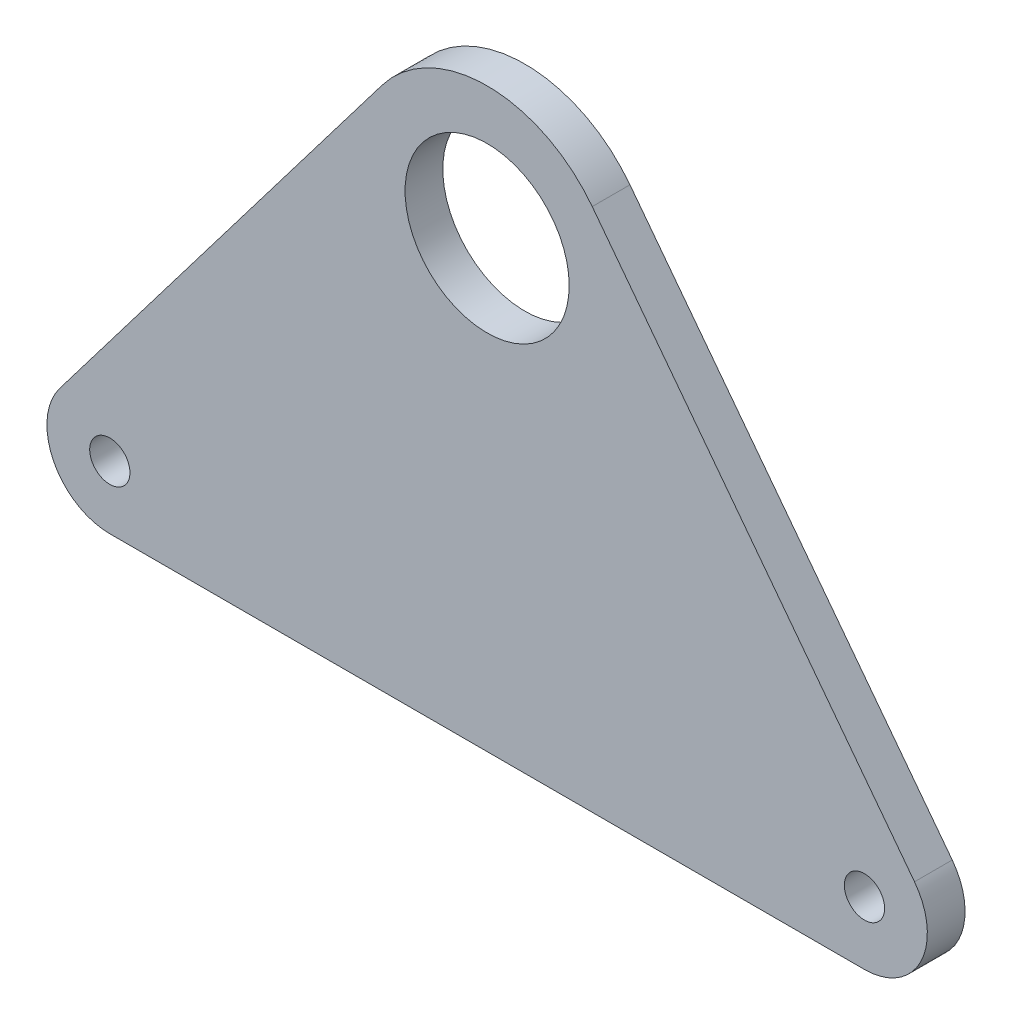
ISO-10303-21;
HEADER;
FILE_DESCRIPTION(('STEP AP214'),'2;1');
FILE_NAME('part.step','',(''),(''),'','','');
FILE_SCHEMA(('AUTOMOTIVE_DESIGN { 1 0 10303 214 1 1 1 1 }'));
ENDSEC;
DATA;
#1=APPLICATION_CONTEXT('core data for automotive mechanical design processes');
#2=APPLICATION_PROTOCOL_DEFINITION('international standard','automotive_design',2000,#1);
#3=PRODUCT_CONTEXT('',#1,'mechanical');
#4=PRODUCT('Part','Part','',(#3));
#5=PRODUCT_RELATED_PRODUCT_CATEGORY('part','',(#4));
#6=PRODUCT_DEFINITION_FORMATION('','',#4);
#7=PRODUCT_DEFINITION_CONTEXT('part definition',#1,'design');
#8=PRODUCT_DEFINITION('design','',#6,#7);
#9=PRODUCT_DEFINITION_SHAPE('','',#8);
#10=(LENGTH_UNIT() NAMED_UNIT(*) SI_UNIT(.MILLI.,.METRE.));
#11=(NAMED_UNIT(*) PLANE_ANGLE_UNIT() SI_UNIT($,.RADIAN.));
#12=(NAMED_UNIT(*) SI_UNIT($,.STERADIAN.) SOLID_ANGLE_UNIT());
#13=UNCERTAINTY_MEASURE_WITH_UNIT(LENGTH_MEASURE(1.E-05),#10,'distance_accuracy_value','');
#14=(GEOMETRIC_REPRESENTATION_CONTEXT(3) GLOBAL_UNCERTAINTY_ASSIGNED_CONTEXT((#13)) GLOBAL_UNIT_ASSIGNED_CONTEXT((#10,
#11,#12)) REPRESENTATION_CONTEXT('',''));
#15=CARTESIAN_POINT('',(0.,0.,0.));
#16=DIRECTION('',(0.,0.,1.));
#17=DIRECTION('',(1.,0.,0.));
#18=AXIS2_PLACEMENT_3D('',#15,#16,#17);
#19=CARTESIAN_POINT('',(0.,0.,3.));
#20=DIRECTION('',(0.,0.,1.));
#21=DIRECTION('',(1.,0.,0.));
#22=AXIS2_PLACEMENT_3D('',#19,#20,#21);
#23=PLANE('',#22);
#24=CARTESIAN_POINT('',(-30.,-30.35,3.));
#25=DIRECTION('',(0.,0.,1.));
#26=DIRECTION('',(1.,0.,0.));
#27=AXIS2_PLACEMENT_3D('',#24,#25,#26);
#28=CIRCLE('',#27,1.6);
#29=CARTESIAN_POINT('',(-28.4,-30.35,3.));
#30=VERTEX_POINT('',#29);
#31=EDGE_CURVE('E184',#30,#30,#28,.T.);
#32=ORIENTED_EDGE('',*,*,#31,.F.);
#33=EDGE_LOOP('',(#32));
#34=FACE_BOUND('',#33,.T.);
#35=CARTESIAN_POINT('',(0.,0.,3.));
#36=DIRECTION('',(0.,0.,1.));
#37=DIRECTION('',(1.,0.,0.));
#38=AXIS2_PLACEMENT_3D('',#35,#36,#37);
#39=CIRCLE('',#38,10.5);
#40=CARTESIAN_POINT('',(8.35661094360238,6.35744080092492,3.));
#41=VERTEX_POINT('',#40);
#42=CARTESIAN_POINT('',(-8.35661094360238,6.35744080092492,3.));
#43=VERTEX_POINT('',#42);
#44=EDGE_CURVE('E129',#41,#43,#39,.T.);
#45=ORIENTED_EDGE('',*,*,#44,.T.);
#46=DIRECTION('',(-0.60547055246904,-0.795867708914513,0.));
#47=VECTOR('',#46,1.);
#48=CARTESIAN_POINT('',(-8.35661094360238,6.35744080092492,3.));
#49=LINE('',#48,#47);
#50=CARTESIAN_POINT('',(-33.9793385445725,-27.3226472376548,3.));
#51=VERTEX_POINT('',#50);
#52=EDGE_CURVE('E87',#43,#51,#49,.T.);
#53=ORIENTED_EDGE('',*,*,#52,.T.);
#54=CARTESIAN_POINT('',(-30.,-30.35,3.));
#55=DIRECTION('',(0.,0.,1.));
#56=DIRECTION('',(1.,0.,0.));
#57=AXIS2_PLACEMENT_3D('',#54,#55,#56);
#58=CIRCLE('',#57,5.);
#59=CARTESIAN_POINT('',(-30.,-35.35,3.));
#60=VERTEX_POINT('',#59);
#61=EDGE_CURVE('E100',#51,#60,#58,.T.);
#62=ORIENTED_EDGE('',*,*,#61,.T.);
#63=DIRECTION('',(1.,0.,0.));
#64=VECTOR('',#63,1.);
#65=CARTESIAN_POINT('',(-30.,-35.35,3.));
#66=LINE('',#65,#64);
#67=CARTESIAN_POINT('',(30.,-35.35,3.));
#68=VERTEX_POINT('',#67);
#69=EDGE_CURVE('E94',#60,#68,#66,.T.);
#70=ORIENTED_EDGE('',*,*,#69,.T.);
#71=CARTESIAN_POINT('',(30.,-30.35,3.));
#72=DIRECTION('',(0.,0.,1.));
#73=DIRECTION('',(-1.,0.,0.));
#74=AXIS2_PLACEMENT_3D('',#71,#72,#73);
#75=CIRCLE('',#74,5.);
#76=CARTESIAN_POINT('',(33.9793385445726,-27.3226472376548,3.));
#77=VERTEX_POINT('',#76);
#78=EDGE_CURVE('E98',#68,#77,#75,.T.);
#79=ORIENTED_EDGE('',*,*,#78,.T.);
#80=DIRECTION('',(-0.60547055246904,0.795867708914513,0.));
#81=VECTOR('',#80,1.);
#82=CARTESIAN_POINT('',(8.35661094360238,6.35744080092492,3.));
#83=LINE('',#82,#81);
#84=EDGE_CURVE('E50',#77,#41,#83,.T.);
#85=ORIENTED_EDGE('',*,*,#84,.T.);
#86=EDGE_LOOP('',(#45,#53,#62,#70,#79,#85));
#87=FACE_BOUND('',#86,.T.);
#88=CARTESIAN_POINT('',(0.,0.,3.));
#89=DIRECTION('',(0.,0.,1.));
#90=DIRECTION('',(1.,0.,0.));
#91=AXIS2_PLACEMENT_3D('',#88,#89,#90);
#92=CIRCLE('',#91,6.525);
#93=CARTESIAN_POINT('',(6.525,0.,3.));
#94=VERTEX_POINT('',#93);
#95=EDGE_CURVE('E122',#94,#94,#92,.T.);
#96=ORIENTED_EDGE('',*,*,#95,.F.);
#97=EDGE_LOOP('',(#96));
#98=FACE_BOUND('',#97,.T.);
#99=CARTESIAN_POINT('',(30.,-30.35,3.));
#100=DIRECTION('',(0.,0.,1.));
#101=DIRECTION('',(-1.,0.,0.));
#102=AXIS2_PLACEMENT_3D('',#99,#100,#101);
#103=CIRCLE('',#102,1.6);
#104=CARTESIAN_POINT('',(28.4,-30.35,3.));
#105=VERTEX_POINT('',#104);
#106=EDGE_CURVE('E175',#105,#105,#103,.T.);
#107=ORIENTED_EDGE('',*,*,#106,.F.);
#108=EDGE_LOOP('',(#107));
#109=FACE_BOUND('',#108,.T.);
#110=ADVANCED_FACE('F33',(#34,#87,#98,#109),#23,.T.);
#111=CARTESIAN_POINT('',(0.,0.,0.));
#112=DIRECTION('',(0.,0.,1.));
#113=DIRECTION('',(1.,0.,0.));
#114=AXIS2_PLACEMENT_3D('',#111,#112,#113);
#115=PLANE('',#114);
#116=CARTESIAN_POINT('',(0.,0.,0.));
#117=DIRECTION('',(0.,0.,1.));
#118=DIRECTION('',(1.,0.,0.));
#119=AXIS2_PLACEMENT_3D('',#116,#117,#118);
#120=CIRCLE('',#119,10.5);
#121=CARTESIAN_POINT('',(8.35661094360238,6.35744080092492,0.));
#122=VERTEX_POINT('',#121);
#123=CARTESIAN_POINT('',(-8.35661094360238,6.35744080092492,0.));
#124=VERTEX_POINT('',#123);
#125=EDGE_CURVE('E118',#122,#124,#120,.T.);
#126=ORIENTED_EDGE('',*,*,#125,.F.);
#127=DIRECTION('',(-0.60547055246904,0.795867708914513,0.));
#128=VECTOR('',#127,1.);
#129=CARTESIAN_POINT('',(8.35661094360238,6.35744080092492,0.));
#130=LINE('',#129,#128);
#131=CARTESIAN_POINT('',(33.9793385445726,-27.3226472376548,0.));
#132=VERTEX_POINT('',#131);
#133=EDGE_CURVE('E79',#132,#122,#130,.T.);
#134=ORIENTED_EDGE('',*,*,#133,.F.);
#135=CARTESIAN_POINT('',(30.,-30.35,0.));
#136=DIRECTION('',(0.,0.,1.));
#137=DIRECTION('',(-1.,0.,0.));
#138=AXIS2_PLACEMENT_3D('',#135,#136,#137);
#139=CIRCLE('',#138,5.);
#140=CARTESIAN_POINT('',(30.,-35.35,0.));
#141=VERTEX_POINT('',#140);
#142=EDGE_CURVE('E73',#141,#132,#139,.T.);
#143=ORIENTED_EDGE('',*,*,#142,.F.);
#144=DIRECTION('',(1.,0.,0.));
#145=VECTOR('',#144,1.);
#146=CARTESIAN_POINT('',(-30.,-35.35,0.));
#147=LINE('',#146,#145);
#148=CARTESIAN_POINT('',(-30.,-35.35,0.));
#149=VERTEX_POINT('',#148);
#150=EDGE_CURVE('E108',#149,#141,#147,.T.);
#151=ORIENTED_EDGE('',*,*,#150,.F.);
#152=CARTESIAN_POINT('',(-30.,-30.35,0.));
#153=DIRECTION('',(0.,0.,1.));
#154=DIRECTION('',(1.,0.,0.));
#155=AXIS2_PLACEMENT_3D('',#152,#153,#154);
#156=CIRCLE('',#155,5.);
#157=CARTESIAN_POINT('',(-33.9793385445725,-27.3226472376548,0.));
#158=VERTEX_POINT('',#157);
#159=EDGE_CURVE('E124',#158,#149,#156,.T.);
#160=ORIENTED_EDGE('',*,*,#159,.F.);
#161=DIRECTION('',(-0.60547055246904,-0.795867708914513,0.));
#162=VECTOR('',#161,1.);
#163=CARTESIAN_POINT('',(-8.35661094360238,6.35744080092492,0.));
#164=LINE('',#163,#162);
#165=EDGE_CURVE('E121',#124,#158,#164,.T.);
#166=ORIENTED_EDGE('',*,*,#165,.F.);
#167=EDGE_LOOP('',(#126,#134,#143,#151,#160,#166));
#168=FACE_BOUND('',#167,.T.);
#169=CARTESIAN_POINT('',(0.,0.,0.));
#170=DIRECTION('',(0.,0.,1.));
#171=DIRECTION('',(1.,0.,0.));
#172=AXIS2_PLACEMENT_3D('',#169,#170,#171);
#173=CIRCLE('',#172,6.525);
#174=CARTESIAN_POINT('',(6.525,0.,0.));
#175=VERTEX_POINT('',#174);
#176=EDGE_CURVE('E187',#175,#175,#173,.T.);
#177=ORIENTED_EDGE('',*,*,#176,.T.);
#178=EDGE_LOOP('',(#177));
#179=FACE_BOUND('',#178,.T.);
#180=CARTESIAN_POINT('',(-30.,-30.35,0.));
#181=DIRECTION('',(0.,0.,1.));
#182=DIRECTION('',(1.,0.,0.));
#183=AXIS2_PLACEMENT_3D('',#180,#181,#182);
#184=CIRCLE('',#183,1.6);
#185=CARTESIAN_POINT('',(-28.4,-30.35,0.));
#186=VERTEX_POINT('',#185);
#187=EDGE_CURVE('E181',#186,#186,#184,.T.);
#188=ORIENTED_EDGE('',*,*,#187,.T.);
#189=EDGE_LOOP('',(#188));
#190=FACE_BOUND('',#189,.T.);
#191=CARTESIAN_POINT('',(30.,-30.35,0.));
#192=DIRECTION('',(0.,0.,1.));
#193=DIRECTION('',(-1.,0.,0.));
#194=AXIS2_PLACEMENT_3D('',#191,#192,#193);
#195=CIRCLE('',#194,1.6);
#196=CARTESIAN_POINT('',(28.4,-30.35,0.));
#197=VERTEX_POINT('',#196);
#198=EDGE_CURVE('E178',#197,#197,#195,.T.);
#199=ORIENTED_EDGE('',*,*,#198,.T.);
#200=EDGE_LOOP('',(#199));
#201=FACE_BOUND('',#200,.T.);
#202=ADVANCED_FACE('F138',(#168,#179,#190,#201),#115,.F.);
#203=CARTESIAN_POINT('',(0.,0.,3.));
#204=DIRECTION('',(0.,0.,-1.));
#205=DIRECTION('',(-1.,0.,0.));
#206=AXIS2_PLACEMENT_3D('',#203,#204,#205);
#207=CYLINDRICAL_SURFACE('',#206,10.5);
#208=ORIENTED_EDGE('',*,*,#125,.T.);
#209=DIRECTION('',(0.,0.,-1.));
#210=VECTOR('',#209,1.);
#211=CARTESIAN_POINT('',(-8.35661094360238,6.35744080092492,3.));
#212=LINE('',#211,#210);
#213=EDGE_CURVE('E11',#43,#124,#212,.T.);
#214=ORIENTED_EDGE('',*,*,#213,.F.);
#215=ORIENTED_EDGE('',*,*,#44,.F.);
#216=DIRECTION('',(0.,0.,-1.));
#217=VECTOR('',#216,1.);
#218=CARTESIAN_POINT('',(8.35661094360238,6.35744080092492,3.));
#219=LINE('',#218,#217);
#220=EDGE_CURVE('E114',#41,#122,#219,.T.);
#221=ORIENTED_EDGE('',*,*,#220,.T.);
#222=EDGE_LOOP('',(#208,#214,#215,#221));
#223=FACE_BOUND('',#222,.T.);
#224=ADVANCED_FACE('F35',(#223),#207,.T.);
#225=CARTESIAN_POINT('',(-8.35661094360238,6.35744080092492,3.));
#226=DIRECTION('',(0.795867708914512,-0.60547055246904,0.));
#227=DIRECTION('',(0.60547055246904,0.795867708914513,0.));
#228=AXIS2_PLACEMENT_3D('',#225,#226,#227);
#229=PLANE('',#228);
#230=ORIENTED_EDGE('',*,*,#165,.T.);
#231=DIRECTION('',(0.,0.,-1.));
#232=VECTOR('',#231,1.);
#233=CARTESIAN_POINT('',(-33.9793385445725,-27.3226472376548,3.));
#234=LINE('',#233,#232);
#235=EDGE_CURVE('E42',#51,#158,#234,.T.);
#236=ORIENTED_EDGE('',*,*,#235,.F.);
#237=ORIENTED_EDGE('',*,*,#52,.F.);
#238=ORIENTED_EDGE('',*,*,#213,.T.);
#239=EDGE_LOOP('',(#230,#236,#237,#238));
#240=FACE_BOUND('',#239,.T.);
#241=ADVANCED_FACE('F237',(#240),#229,.F.);
#242=CARTESIAN_POINT('',(-30.,-30.35,3.));
#243=DIRECTION('',(0.,0.,-1.));
#244=DIRECTION('',(-1.,0.,0.));
#245=AXIS2_PLACEMENT_3D('',#242,#243,#244);
#246=CYLINDRICAL_SURFACE('',#245,5.);
#247=ORIENTED_EDGE('',*,*,#159,.T.);
#248=DIRECTION('',(0.,0.,-1.));
#249=VECTOR('',#248,1.);
#250=CARTESIAN_POINT('',(-30.,-35.35,3.));
#251=LINE('',#250,#249);
#252=EDGE_CURVE('E109',#60,#149,#251,.T.);
#253=ORIENTED_EDGE('',*,*,#252,.F.);
#254=ORIENTED_EDGE('',*,*,#61,.F.);
#255=ORIENTED_EDGE('',*,*,#235,.T.);
#256=EDGE_LOOP('',(#247,#253,#254,#255));
#257=FACE_BOUND('',#256,.T.);
#258=ADVANCED_FACE('F135',(#257),#246,.T.);
#259=CARTESIAN_POINT('',(-30.,-35.35,3.));
#260=DIRECTION('',(0.,1.,0.));
#261=DIRECTION('',(-1.,0.,0.));
#262=AXIS2_PLACEMENT_3D('',#259,#260,#261);
#263=PLANE('',#262);
#264=ORIENTED_EDGE('',*,*,#150,.T.);
#265=DIRECTION('',(0.,0.,-1.));
#266=VECTOR('',#265,1.);
#267=CARTESIAN_POINT('',(30.,-35.35,3.));
#268=LINE('',#267,#266);
#269=EDGE_CURVE('E105',#68,#141,#268,.T.);
#270=ORIENTED_EDGE('',*,*,#269,.F.);
#271=ORIENTED_EDGE('',*,*,#69,.F.);
#272=ORIENTED_EDGE('',*,*,#252,.T.);
#273=EDGE_LOOP('',(#264,#270,#271,#272));
#274=FACE_BOUND('',#273,.T.);
#275=ADVANCED_FACE('F106',(#274),#263,.F.);
#276=CARTESIAN_POINT('',(30.,-30.35,3.));
#277=DIRECTION('',(0.,0.,-1.));
#278=DIRECTION('',(-1.,0.,0.));
#279=AXIS2_PLACEMENT_3D('',#276,#277,#278);
#280=CYLINDRICAL_SURFACE('',#279,5.);
#281=ORIENTED_EDGE('',*,*,#142,.T.);
#282=DIRECTION('',(0.,0.,-1.));
#283=VECTOR('',#282,1.);
#284=CARTESIAN_POINT('',(33.9793385445726,-27.3226472376548,3.));
#285=LINE('',#284,#283);
#286=EDGE_CURVE('E110',#77,#132,#285,.T.);
#287=ORIENTED_EDGE('',*,*,#286,.F.);
#288=ORIENTED_EDGE('',*,*,#78,.F.);
#289=ORIENTED_EDGE('',*,*,#269,.T.);
#290=EDGE_LOOP('',(#281,#287,#288,#289));
#291=FACE_BOUND('',#290,.T.);
#292=ADVANCED_FACE('F112',(#291),#280,.T.);
#293=CARTESIAN_POINT('',(8.35661094360238,6.35744080092492,3.));
#294=DIRECTION('',(-0.795867708914512,-0.60547055246904,0.));
#295=DIRECTION('',(0.60547055246904,-0.795867708914513,0.));
#296=AXIS2_PLACEMENT_3D('',#293,#294,#295);
#297=PLANE('',#296);
#298=ORIENTED_EDGE('',*,*,#133,.T.);
#299=ORIENTED_EDGE('',*,*,#220,.F.);
#300=ORIENTED_EDGE('',*,*,#84,.F.);
#301=ORIENTED_EDGE('',*,*,#286,.T.);
#302=EDGE_LOOP('',(#298,#299,#300,#301));
#303=FACE_BOUND('',#302,.T.);
#304=ADVANCED_FACE('F143',(#303),#297,.F.);
#305=CARTESIAN_POINT('',(0.,0.,3.));
#306=DIRECTION('',(0.,0.,-1.));
#307=DIRECTION('',(-1.,0.,0.));
#308=AXIS2_PLACEMENT_3D('',#305,#306,#307);
#309=CYLINDRICAL_SURFACE('',#308,6.525);
#310=ORIENTED_EDGE('',*,*,#95,.T.);
#311=EDGE_LOOP('',(#310));
#312=FACE_BOUND('',#311,.T.);
#313=ORIENTED_EDGE('',*,*,#176,.F.);
#314=EDGE_LOOP('',(#313));
#315=FACE_BOUND('',#314,.T.);
#316=ADVANCED_FACE('F145',(#312,#315),#309,.F.);
#317=CARTESIAN_POINT('',(-30.,-30.35,3.));
#318=DIRECTION('',(0.,0.,-1.));
#319=DIRECTION('',(-1.,0.,0.));
#320=AXIS2_PLACEMENT_3D('',#317,#318,#319);
#321=CYLINDRICAL_SURFACE('',#320,1.6);
#322=ORIENTED_EDGE('',*,*,#31,.T.);
#323=EDGE_LOOP('',(#322));
#324=FACE_BOUND('',#323,.T.);
#325=ORIENTED_EDGE('',*,*,#187,.F.);
#326=EDGE_LOOP('',(#325));
#327=FACE_BOUND('',#326,.T.);
#328=ADVANCED_FACE('F151',(#324,#327),#321,.F.);
#329=CARTESIAN_POINT('',(30.,-30.35,3.));
#330=DIRECTION('',(0.,0.,-1.));
#331=DIRECTION('',(-1.,0.,0.));
#332=AXIS2_PLACEMENT_3D('',#329,#330,#331);
#333=CYLINDRICAL_SURFACE('',#332,1.6);
#334=ORIENTED_EDGE('',*,*,#106,.T.);
#335=EDGE_LOOP('',(#334));
#336=FACE_BOUND('',#335,.T.);
#337=ORIENTED_EDGE('',*,*,#198,.F.);
#338=EDGE_LOOP('',(#337));
#339=FACE_BOUND('',#338,.T.);
#340=ADVANCED_FACE('F166',(#336,#339),#333,.F.);
#341=CLOSED_SHELL('',(#110,#202,#224,#241,#258,#275,#292,#304,#316,#328,#340));
#342=MANIFOLD_SOLID_BREP('B2',#341);
#343=ADVANCED_BREP_SHAPE_REPRESENTATION('',(#18,#342),#14);
#344=SHAPE_DEFINITION_REPRESENTATION(#9,#343);
ENDSEC;
END-ISO-10303-21;
